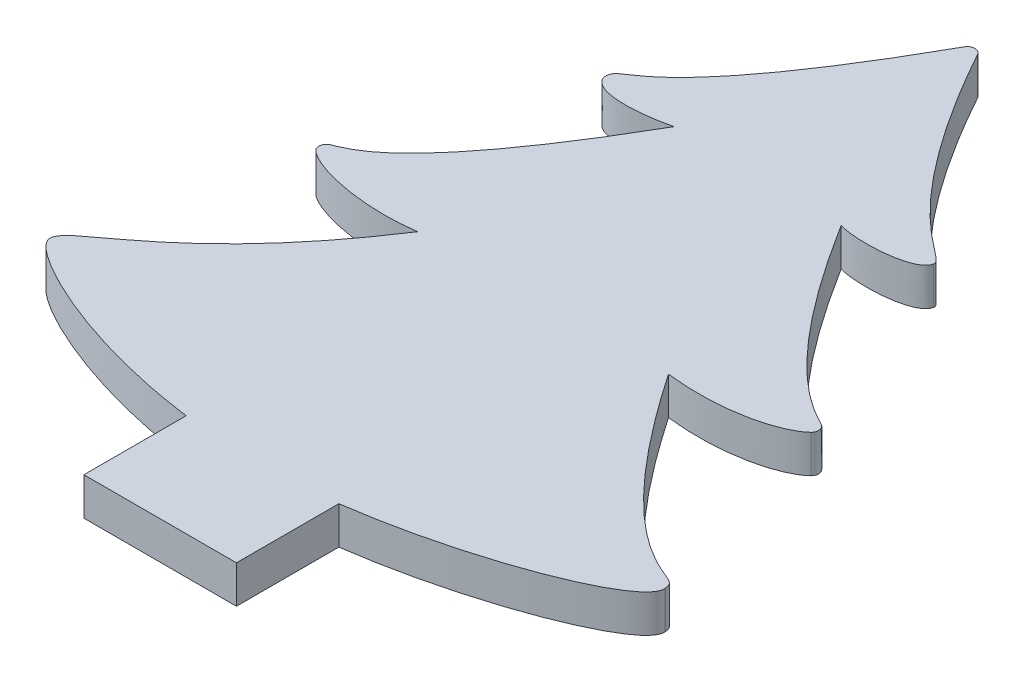
ISO-10303-21;
HEADER;
FILE_DESCRIPTION(('STEP AP214'),'2;1');
FILE_NAME('part.step','',(''),(''),'','','');
FILE_SCHEMA(('AUTOMOTIVE_DESIGN { 1 0 10303 214 1 1 1 1 }'));
ENDSEC;
DATA;
#1=APPLICATION_CONTEXT('core data for automotive mechanical design processes');
#2=APPLICATION_PROTOCOL_DEFINITION('international standard','automotive_design',2000,#1);
#3=PRODUCT_CONTEXT('',#1,'mechanical');
#4=PRODUCT('Part','Part','',(#3));
#5=PRODUCT_RELATED_PRODUCT_CATEGORY('part','',(#4));
#6=PRODUCT_DEFINITION_FORMATION('','',#4);
#7=PRODUCT_DEFINITION_CONTEXT('part definition',#1,'design');
#8=PRODUCT_DEFINITION('design','',#6,#7);
#9=PRODUCT_DEFINITION_SHAPE('','',#8);
#10=(LENGTH_UNIT() NAMED_UNIT(*) SI_UNIT(.MILLI.,.METRE.));
#11=(NAMED_UNIT(*) PLANE_ANGLE_UNIT() SI_UNIT($,.RADIAN.));
#12=(NAMED_UNIT(*) SI_UNIT($,.STERADIAN.) SOLID_ANGLE_UNIT());
#13=UNCERTAINTY_MEASURE_WITH_UNIT(LENGTH_MEASURE(1.E-05),#10,'distance_accuracy_value','');
#14=(GEOMETRIC_REPRESENTATION_CONTEXT(3) GLOBAL_UNCERTAINTY_ASSIGNED_CONTEXT((#13)) GLOBAL_UNIT_ASSIGNED_CONTEXT((#10,
#11,#12)) REPRESENTATION_CONTEXT('',''));
#15=CARTESIAN_POINT('',(0.,0.,0.));
#16=DIRECTION('',(0.,0.,1.));
#17=DIRECTION('',(1.,0.,0.));
#18=AXIS2_PLACEMENT_3D('',#15,#16,#17);
#19=CARTESIAN_POINT('',(-26.46094707479,5.,-51.1142111528936));
#20=CARTESIAN_POINT('',(-43.2890628601737,5.,-20.4825244166261));
#21=CARTESIAN_POINT('',(-47.9718443473797,5.,-25.3018231207679));
#22=CARTESIAN_POINT('',(-47.800827469106,5.,-22.1543100976667));
#23=B_SPLINE_CURVE_WITH_KNOTS('',3,(#19,#20,#21,#22),.UNSPECIFIED.,.F.,.F.,(4,4),(0.,1.),.UNSPECIFIED.);
#24=DIRECTION('',(0.,-1.,0.));
#25=VECTOR('',#24,1.);
#26=SURFACE_OF_LINEAR_EXTRUSION('',#23,#25);
#27=CARTESIAN_POINT('',(-27.3403097795806,5.,-49.5258288658324));
#28=VERTEX_POINT('',#27);
#29=CARTESIAN_POINT('',(-47.8051715184404,5.,-22.2851959053024));
#30=VERTEX_POINT('',#29);
#31=EDGE_CURVE('E282',#28,#30,#23,.T.);
#32=ORIENTED_EDGE('',*,*,#31,.F.);
#33=DIRECTION('',(0.,-1.,0.));
#34=VECTOR('',#33,1.);
#35=CARTESIAN_POINT('',(-27.3403097795806,5.,-49.5258288658324));
#36=LINE('',#35,#34);
#37=CARTESIAN_POINT('',(-27.3403097795806,0.,-49.5258288658324));
#38=VERTEX_POINT('',#37);
#39=EDGE_CURVE('E383',#28,#38,#36,.T.);
#40=ORIENTED_EDGE('',*,*,#39,.T.);
#41=CARTESIAN_POINT('',(-26.46094707479,0.,-51.1142111528936));
#42=CARTESIAN_POINT('',(-43.2890628601737,0.,-20.4825244166261));
#43=CARTESIAN_POINT('',(-47.9718443473797,0.,-25.3018231207679));
#44=CARTESIAN_POINT('',(-47.800827469106,0.,-22.1543100976667));
#45=B_SPLINE_CURVE_WITH_KNOTS('',3,(#41,#42,#43,#44),.UNSPECIFIED.,.F.,.F.,(4,4),(0.,1.),.UNSPECIFIED.);
#46=CARTESIAN_POINT('',(-47.8051715184404,0.,-22.2851959053024));
#47=VERTEX_POINT('',#46);
#48=EDGE_CURVE('E511',#38,#47,#45,.T.);
#49=ORIENTED_EDGE('',*,*,#48,.T.);
#50=DIRECTION('',(0.,-1.,0.));
#51=VECTOR('',#50,1.);
#52=CARTESIAN_POINT('',(-47.8051715184404,0.,-22.2851959053024));
#53=LINE('',#52,#51);
#54=EDGE_CURVE('E317',#47,#30,#53,.F.);
#55=ORIENTED_EDGE('',*,*,#54,.T.);
#56=EDGE_LOOP('',(#32,#40,#49,#55));
#57=FACE_BOUND('',#56,.T.);
#58=ADVANCED_FACE('F40',(#57),#26,.F.);
#59=CARTESIAN_POINT('',(-47.800827469106,5.,-22.1543100976667));
#60=CARTESIAN_POINT('',(-47.4104047515543,5.,-20.1884154408875));
#61=CARTESIAN_POINT('',(-42.9397855502199,5.,-19.7613952442805));
#62=CARTESIAN_POINT('',(-37.4406139998054,5.,-21.054048915975));
#63=B_SPLINE_CURVE_WITH_KNOTS('',3,(#59,#60,#61,#62),.UNSPECIFIED.,.F.,.F.,(4,4),(0.,1.),.UNSPECIFIED.);
#64=DIRECTION('',(0.,-1.,0.));
#65=VECTOR('',#64,1.);
#66=SURFACE_OF_LINEAR_EXTRUSION('',#63,#65);
#67=CARTESIAN_POINT('',(-47.7471264173741,5.,-21.9595594724381));
#68=VERTEX_POINT('',#67);
#69=CARTESIAN_POINT('',(-37.4406139998054,5.,-21.054048915975));
#70=VERTEX_POINT('',#69);
#71=EDGE_CURVE('E422',#68,#70,#63,.T.);
#72=ORIENTED_EDGE('',*,*,#71,.F.);
#73=DIRECTION('',(0.,-1.,0.));
#74=VECTOR('',#73,1.);
#75=CARTESIAN_POINT('',(-47.7471264173741,5.,-21.959559472438));
#76=LINE('',#75,#74);
#77=CARTESIAN_POINT('',(-47.7471264173741,0.,-21.9595594724381));
#78=VERTEX_POINT('',#77);
#79=EDGE_CURVE('E303',#68,#78,#76,.T.);
#80=ORIENTED_EDGE('',*,*,#79,.T.);
#81=CARTESIAN_POINT('',(-47.800827469106,0.,-22.1543100976667));
#82=CARTESIAN_POINT('',(-47.4104047515543,0.,-20.1884154408875));
#83=CARTESIAN_POINT('',(-42.9397855502199,0.,-19.7613952442805));
#84=CARTESIAN_POINT('',(-37.4406139998054,0.,-21.054048915975));
#85=B_SPLINE_CURVE_WITH_KNOTS('',3,(#81,#82,#83,#84),.UNSPECIFIED.,.F.,.F.,(4,4),(0.,1.),.UNSPECIFIED.);
#86=CARTESIAN_POINT('',(-37.4406139998054,0.,-21.054048915975));
#87=VERTEX_POINT('',#86);
#88=EDGE_CURVE('E516',#78,#87,#85,.T.);
#89=ORIENTED_EDGE('',*,*,#88,.T.);
#90=DIRECTION('',(0.,-1.,0.));
#91=VECTOR('',#90,1.);
#92=CARTESIAN_POINT('',(-37.4406139998054,5.,-21.054048915975));
#93=LINE('',#92,#91);
#94=EDGE_CURVE('E299',#70,#87,#93,.T.);
#95=ORIENTED_EDGE('',*,*,#94,.F.);
#96=EDGE_LOOP('',(#72,#80,#89,#95));
#97=FACE_BOUND('',#96,.T.);
#98=ADVANCED_FACE('F443',(#97),#66,.F.);
#99=CARTESIAN_POINT('',(-37.4406139998054,5.,-21.054048915975));
#100=CARTESIAN_POINT('',(-53.7464806232736,5.,7.34837010130482));
#101=CARTESIAN_POINT('',(-58.6463566748657,5.,2.30572016613151));
#102=CARTESIAN_POINT('',(-58.8963401885391,5.,4.69945124017866));
#103=B_SPLINE_CURVE_WITH_KNOTS('',3,(#99,#100,#101,#102),.UNSPECIFIED.,.F.,.F.,(4,4),(0.,1.),.UNSPECIFIED.);
#104=DIRECTION('',(0.,-1.,0.));
#105=VECTOR('',#104,1.);
#106=SURFACE_OF_LINEAR_EXTRUSION('',#103,#105);
#107=CARTESIAN_POINT('',(-37.4406139998054,0.,-21.054048915975));
#108=CARTESIAN_POINT('',(-53.7464806232736,0.,7.34837010130482));
#109=CARTESIAN_POINT('',(-58.6463566748657,0.,2.30572016613151));
#110=CARTESIAN_POINT('',(-58.8963401885391,0.,4.69945124017866));
#111=B_SPLINE_CURVE_WITH_KNOTS('',3,(#107,#108,#109,#110),.UNSPECIFIED.,.F.,.F.,(4,4),(0.,1.),.UNSPECIFIED.);
#112=CARTESIAN_POINT('',(-58.21100737465,0.,3.86325577012163));
#113=VERTEX_POINT('',#112);
#114=EDGE_CURVE('E570',#87,#113,#111,.T.);
#115=ORIENTED_EDGE('',*,*,#114,.T.);
#116=DIRECTION('',(0.,-1.,0.));
#117=VECTOR('',#116,1.);
#118=CARTESIAN_POINT('',(-58.21100737465,0.,3.86325577012163));
#119=LINE('',#118,#117);
#120=CARTESIAN_POINT('',(-58.21100737465,5.,3.86325577012163));
#121=VERTEX_POINT('',#120);
#122=EDGE_CURVE('E339',#113,#121,#119,.F.);
#123=ORIENTED_EDGE('',*,*,#122,.T.);
#124=EDGE_CURVE('E418',#70,#121,#103,.T.);
#125=ORIENTED_EDGE('',*,*,#124,.F.);
#126=ORIENTED_EDGE('',*,*,#94,.T.);
#127=EDGE_LOOP('',(#115,#123,#125,#126));
#128=FACE_BOUND('',#127,.T.);
#129=ADVANCED_FACE('F604',(#128),#106,.F.);
#130=CARTESIAN_POINT('',(-58.8963401885391,5.,4.69945124017865));
#131=CARTESIAN_POINT('',(-59.0306459865497,5.,6.4806781155983));
#132=CARTESIAN_POINT('',(-50.7799627606112,5.,9.25178864561152));
#133=CARTESIAN_POINT('',(-42.3819496602005,5.,8.05091230420457));
#134=B_SPLINE_CURVE_WITH_KNOTS('',3,(#130,#131,#132,#133),.UNSPECIFIED.,.F.,.F.,(4,4),(0.,1.),.UNSPECIFIED.);
#135=DIRECTION('',(0.,-1.,0.));
#136=VECTOR('',#135,1.);
#137=SURFACE_OF_LINEAR_EXTRUSION('',#134,#136);
#138=CARTESIAN_POINT('',(-58.4802850236266,5.,5.49409460981877));
#139=VERTEX_POINT('',#138);
#140=CARTESIAN_POINT('',(-42.3819496602005,5.,8.05091230420457));
#141=VERTEX_POINT('',#140);
#142=EDGE_CURVE('E415',#139,#141,#134,.T.);
#143=ORIENTED_EDGE('',*,*,#142,.F.);
#144=DIRECTION('',(0.,-1.,0.));
#145=VECTOR('',#144,1.);
#146=CARTESIAN_POINT('',(-58.4802850236266,5.,5.49409460981876));
#147=LINE('',#146,#145);
#148=CARTESIAN_POINT('',(-58.4802850236266,0.,5.49409460981877));
#149=VERTEX_POINT('',#148);
#150=EDGE_CURVE('E335',#139,#149,#147,.T.);
#151=ORIENTED_EDGE('',*,*,#150,.T.);
#152=CARTESIAN_POINT('',(-58.8963401885391,0.,4.69945124017865));
#153=CARTESIAN_POINT('',(-59.0306459865497,0.,6.4806781155983));
#154=CARTESIAN_POINT('',(-50.7799627606112,0.,9.25178864561152));
#155=CARTESIAN_POINT('',(-42.3819496602005,0.,8.05091230420457));
#156=B_SPLINE_CURVE_WITH_KNOTS('',3,(#152,#153,#154,#155),.UNSPECIFIED.,.F.,.F.,(4,4),(0.,1.),.UNSPECIFIED.);
#157=CARTESIAN_POINT('',(-42.3819496602005,0.,8.05091230420457));
#158=VERTEX_POINT('',#157);
#159=EDGE_CURVE('E228',#149,#158,#156,.T.);
#160=ORIENTED_EDGE('',*,*,#159,.T.);
#161=DIRECTION('',(0.,-1.,0.));
#162=VECTOR('',#161,1.);
#163=CARTESIAN_POINT('',(-42.3819496602005,5.,8.05091230420457));
#164=LINE('',#163,#162);
#165=EDGE_CURVE('E295',#141,#158,#164,.T.);
#166=ORIENTED_EDGE('',*,*,#165,.F.);
#167=EDGE_LOOP('',(#143,#151,#160,#166));
#168=FACE_BOUND('',#167,.T.);
#169=ADVANCED_FACE('F591',(#168),#137,.F.);
#170=CARTESIAN_POINT('',(-42.3819496602005,5.,8.05091230420457));
#171=CARTESIAN_POINT('',(-55.2657430992836,5.,27.8352838186386));
#172=CARTESIAN_POINT('',(-66.3455714112481,5.,30.4835954617912));
#173=CARTESIAN_POINT('',(-66.0463014559429,5.,33.3060006103379));
#174=B_SPLINE_CURVE_WITH_KNOTS('',3,(#170,#171,#172,#173),.UNSPECIFIED.,.F.,.F.,(4,4),(0.,1.),.UNSPECIFIED.);
#175=DIRECTION('',(0.,-1.,0.));
#176=VECTOR('',#175,1.);
#177=SURFACE_OF_LINEAR_EXTRUSION('',#174,#176);
#178=CARTESIAN_POINT('',(-42.3819496602005,0.,8.05091230420457));
#179=CARTESIAN_POINT('',(-55.2657430992836,0.,27.8352838186386));
#180=CARTESIAN_POINT('',(-66.3455714112481,0.,30.4835954617912));
#181=CARTESIAN_POINT('',(-66.0463014559429,0.,33.3060006103379));
#182=B_SPLINE_CURVE_WITH_KNOTS('',3,(#178,#179,#180,#181),.UNSPECIFIED.,.F.,.F.,(4,4),(0.,1.),.UNSPECIFIED.);
#183=CARTESIAN_POINT('',(-66.0481648431497,0.,33.2867693837771));
#184=VERTEX_POINT('',#183);
#185=EDGE_CURVE('E221',#158,#184,#182,.T.);
#186=ORIENTED_EDGE('',*,*,#185,.T.);
#187=DIRECTION('',(0.,-1.,0.));
#188=VECTOR('',#187,1.);
#189=CARTESIAN_POINT('',(-66.0481648431497,0.,33.2867693837771));
#190=LINE('',#189,#188);
#191=CARTESIAN_POINT('',(-66.0481648431497,5.,33.2867693837771));
#192=VERTEX_POINT('',#191);
#193=EDGE_CURVE('E332',#184,#192,#190,.F.);
#194=ORIENTED_EDGE('',*,*,#193,.T.);
#195=EDGE_CURVE('E411',#141,#192,#174,.T.);
#196=ORIENTED_EDGE('',*,*,#195,.F.);
#197=ORIENTED_EDGE('',*,*,#165,.T.);
#198=EDGE_LOOP('',(#186,#194,#196,#197));
#199=FACE_BOUND('',#198,.T.);
#200=ADVANCED_FACE('F596',(#199),#177,.F.);
#201=CARTESIAN_POINT('',(-66.0463014559429,5.,33.3060006103379));
#202=CARTESIAN_POINT('',(-65.9776236253739,5.,36.050325122992));
#203=CARTESIAN_POINT('',(-47.6816741974499,5.,45.2884353869615));
#204=CARTESIAN_POINT('',(-26.4609470747899,5.,45.2615921349245));
#205=B_SPLINE_CURVE_WITH_KNOTS('',3,(#201,#202,#203,#204),.UNSPECIFIED.,.F.,.F.,(4,4),(0.,1.),.UNSPECIFIED.);
#206=DIRECTION('',(0.,-1.,0.));
#207=VECTOR('',#206,1.);
#208=SURFACE_OF_LINEAR_EXTRUSION('',#205,#207);
#209=CARTESIAN_POINT('',(-66.0463014559429,0.,33.3060006103379));
#210=CARTESIAN_POINT('',(-65.9776236253739,0.,36.050325122992));
#211=CARTESIAN_POINT('',(-47.6816741974499,0.,45.2884353869615));
#212=CARTESIAN_POINT('',(-26.4609470747899,0.,45.2615921349245));
#213=B_SPLINE_CURVE_WITH_KNOTS('',3,(#209,#210,#211,#212),.UNSPECIFIED.,.F.,.F.,(4,4),(0.,1.),.UNSPECIFIED.);
#214=CARTESIAN_POINT('',(-66.0456582109323,0.,33.3227895523358));
#215=VERTEX_POINT('',#214);
#216=CARTESIAN_POINT('',(-36.5955437582762,0.,44.5970663604738));
#217=VERTEX_POINT('',#216);
#218=EDGE_CURVE('E208',#215,#217,#213,.T.);
#219=ORIENTED_EDGE('',*,*,#218,.T.);
#220=DIRECTION('',(0.,1.,0.));
#221=VECTOR('',#220,1.);
#222=CARTESIAN_POINT('',(-36.5955437582762,0.,44.5970663604738));
#223=LINE('',#222,#221);
#224=CARTESIAN_POINT('',(-36.5955437582762,5.,44.5970663604738));
#225=VERTEX_POINT('',#224);
#226=EDGE_CURVE('E190',#217,#225,#223,.T.);
#227=ORIENTED_EDGE('',*,*,#226,.T.);
#228=CARTESIAN_POINT('',(-66.0456582109323,5.,33.3227895523358));
#229=VERTEX_POINT('',#228);
#230=EDGE_CURVE('E408',#229,#225,#205,.T.);
#231=ORIENTED_EDGE('',*,*,#230,.F.);
#232=DIRECTION('',(0.,-1.,0.));
#233=VECTOR('',#232,1.);
#234=CARTESIAN_POINT('',(-66.0456582109324,5.,33.3227895523358));
#235=LINE('',#234,#233);
#236=EDGE_CURVE('E218',#229,#215,#235,.T.);
#237=ORIENTED_EDGE('',*,*,#236,.T.);
#238=EDGE_LOOP('',(#219,#227,#231,#237));
#239=FACE_BOUND('',#238,.T.);
#240=ADVANCED_FACE('F216',(#239),#208,.F.);
#241=CARTESIAN_POINT('',(-26.46094707479,5.,45.2615921349245));
#242=CARTESIAN_POINT('',(-9.67683552126472,5.,45.5867609119514));
#243=CARTESIAN_POINT('',(15.6871116916868,5.,36.8617452655546));
#244=CARTESIAN_POINT('',(15.0600009477621,5.,32.6373889791137));
#245=B_SPLINE_CURVE_WITH_KNOTS('',3,(#241,#242,#243,#244),.UNSPECIFIED.,.F.,.F.,(4,4),(0.,1.),.UNSPECIFIED.);
#246=DIRECTION('',(0.,-1.,0.));
#247=VECTOR('',#246,1.);
#248=SURFACE_OF_LINEAR_EXTRUSION('',#245,#247);
#249=CARTESIAN_POINT('',(-16.334320806362,5.,44.5781330491212));
#250=VERTEX_POINT('',#249);
#251=CARTESIAN_POINT('',(15.0648258625216,5.,32.6744679738626));
#252=VERTEX_POINT('',#251);
#253=EDGE_CURVE('E405',#250,#252,#245,.T.);
#254=ORIENTED_EDGE('',*,*,#253,.F.);
#255=DIRECTION('',(0.,1.,0.));
#256=VECTOR('',#255,1.);
#257=CARTESIAN_POINT('',(-16.334320806362,0.,44.5781330491212));
#258=LINE('',#257,#256);
#259=CARTESIAN_POINT('',(-16.334320806362,0.,44.5781330491212));
#260=VERTEX_POINT('',#259);
#261=EDGE_CURVE('E507',#260,#250,#258,.T.);
#262=ORIENTED_EDGE('',*,*,#261,.F.);
#263=CARTESIAN_POINT('',(-26.46094707479,0.,45.2615921349245));
#264=CARTESIAN_POINT('',(-9.67683552126472,0.,45.5867609119514));
#265=CARTESIAN_POINT('',(15.6871116916868,0.,36.8617452655546));
#266=CARTESIAN_POINT('',(15.0600009477621,0.,32.6373889791137));
#267=B_SPLINE_CURVE_WITH_KNOTS('',3,(#263,#264,#265,#266),.UNSPECIFIED.,.F.,.F.,(4,4),(0.,1.),.UNSPECIFIED.);
#268=CARTESIAN_POINT('',(15.0648258625216,0.,32.6744679738626));
#269=VERTEX_POINT('',#268);
#270=EDGE_CURVE('E220',#260,#269,#267,.T.);
#271=ORIENTED_EDGE('',*,*,#270,.T.);
#272=DIRECTION('',(0.,-1.,0.));
#273=VECTOR('',#272,1.);
#274=CARTESIAN_POINT('',(15.0648258625216,0.,32.6744679738626));
#275=LINE('',#274,#273);
#276=EDGE_CURVE('E353',#269,#252,#275,.F.);
#277=ORIENTED_EDGE('',*,*,#276,.T.);
#278=EDGE_LOOP('',(#254,#262,#271,#277));
#279=FACE_BOUND('',#278,.T.);
#280=ADVANCED_FACE('F505',(#279),#248,.F.);
#281=CARTESIAN_POINT('',(15.0600009477621,5.,32.6373889791137));
#282=CARTESIAN_POINT('',(15.0225458596558,5.,29.4750851951426));
#283=CARTESIAN_POINT('',(8.96279055385009,5.,34.7017587488998));
#284=CARTESIAN_POINT('',(-9.33864147602932,5.,7.79119338360951));
#285=B_SPLINE_CURVE_WITH_KNOTS('',3,(#281,#282,#283,#284),.UNSPECIFIED.,.F.,.F.,(4,4),(0.,1.),.UNSPECIFIED.);
#286=DIRECTION('',(0.,-1.,0.));
#287=VECTOR('',#286,1.);
#288=SURFACE_OF_LINEAR_EXTRUSION('',#285,#287);
#289=CARTESIAN_POINT('',(15.0590815907543,5.,32.5936312008287));
#290=VERTEX_POINT('',#289);
#291=CARTESIAN_POINT('',(-9.33864147602941,5.,7.7911933836095));
#292=VERTEX_POINT('',#291);
#293=EDGE_CURVE('E402',#290,#292,#285,.T.);
#294=ORIENTED_EDGE('',*,*,#293,.F.);
#295=DIRECTION('',(0.,-1.,0.));
#296=VECTOR('',#295,1.);
#297=CARTESIAN_POINT('',(15.0590815907542,5.,32.5936312008254));
#298=LINE('',#297,#296);
#299=CARTESIAN_POINT('',(15.0590815907543,0.,32.5936312008287));
#300=VERTEX_POINT('',#299);
#301=EDGE_CURVE('E349',#290,#300,#298,.T.);
#302=ORIENTED_EDGE('',*,*,#301,.T.);
#303=CARTESIAN_POINT('',(15.0600009477621,0.,32.6373889791137));
#304=CARTESIAN_POINT('',(15.0225458596558,0.,29.4750851951426));
#305=CARTESIAN_POINT('',(8.96279055385009,0.,34.7017587488998));
#306=CARTESIAN_POINT('',(-9.33864147602932,0.,7.79119338360951));
#307=B_SPLINE_CURVE_WITH_KNOTS('',3,(#303,#304,#305,#306),.UNSPECIFIED.,.F.,.F.,(4,4),(0.,1.),.UNSPECIFIED.);
#308=CARTESIAN_POINT('',(-9.33864147602941,0.,7.7911933836095));
#309=VERTEX_POINT('',#308);
#310=EDGE_CURVE('E225',#300,#309,#307,.T.);
#311=ORIENTED_EDGE('',*,*,#310,.T.);
#312=DIRECTION('',(0.,-1.,0.));
#313=VECTOR('',#312,1.);
#314=CARTESIAN_POINT('',(-9.33864147602941,5.,7.7911933836095));
#315=LINE('',#314,#313);
#316=EDGE_CURVE('E290',#292,#309,#315,.T.);
#317=ORIENTED_EDGE('',*,*,#316,.F.);
#318=EDGE_LOOP('',(#294,#302,#311,#317));
#319=FACE_BOUND('',#318,.T.);
#320=ADVANCED_FACE('F499',(#319),#288,.F.);
#321=CARTESIAN_POINT('',(-9.33864147602941,5.,7.7911933836095));
#322=CARTESIAN_POINT('',(-0.79960966506997,5.,8.76818365390028));
#323=CARTESIAN_POINT('',(5.63836749180853,5.,6.68150425234732));
#324=CARTESIAN_POINT('',(7.17289225562503,5.,4.60126431144356));
#325=B_SPLINE_CURVE_WITH_KNOTS('',3,(#321,#322,#323,#324),.UNSPECIFIED.,.F.,.F.,(4,4),(0.,1.),.UNSPECIFIED.);
#326=DIRECTION('',(0.,-1.,0.));
#327=VECTOR('',#326,1.);
#328=SURFACE_OF_LINEAR_EXTRUSION('',#325,#327);
#329=CARTESIAN_POINT('',(-9.33864147602941,0.,7.7911933836095));
#330=CARTESIAN_POINT('',(-0.79960966506997,0.,8.76818365390028));
#331=CARTESIAN_POINT('',(5.63836749180853,0.,6.68150425234732));
#332=CARTESIAN_POINT('',(7.17289225562503,0.,4.60126431144356));
#333=B_SPLINE_CURVE_WITH_KNOTS('',3,(#329,#330,#331,#332),.UNSPECIFIED.,.F.,.F.,(4,4),(0.,1.),.UNSPECIFIED.);
#334=CARTESIAN_POINT('',(6.79872593204115,0.,5.01906328379935));
#335=VERTEX_POINT('',#334);
#336=EDGE_CURVE('E248',#309,#335,#333,.T.);
#337=ORIENTED_EDGE('',*,*,#336,.T.);
#338=DIRECTION('',(0.,-1.,0.));
#339=VECTOR('',#338,1.);
#340=CARTESIAN_POINT('',(6.79872593204115,0.,5.01906328379935));
#341=LINE('',#340,#339);
#342=CARTESIAN_POINT('',(6.79872593204115,5.,5.01906328379935));
#343=VERTEX_POINT('',#342);
#344=EDGE_CURVE('E361',#335,#343,#341,.F.);
#345=ORIENTED_EDGE('',*,*,#344,.T.);
#346=EDGE_CURVE('E398',#292,#343,#325,.T.);
#347=ORIENTED_EDGE('',*,*,#346,.F.);
#348=ORIENTED_EDGE('',*,*,#316,.T.);
#349=EDGE_LOOP('',(#337,#345,#347,#348));
#350=FACE_BOUND('',#349,.T.);
#351=ADVANCED_FACE('F495',(#350),#328,.F.);
#352=CARTESIAN_POINT('',(7.17289225562503,5.,4.60126431144356));
#353=CARTESIAN_POINT('',(8.22123179046032,5.,2.12767223664505));
#354=CARTESIAN_POINT('',(1.78727035083967,5.,6.10389935117822));
#355=CARTESIAN_POINT('',(-14.9929544013102,5.,-20.804801043491));
#356=B_SPLINE_CURVE_WITH_KNOTS('',3,(#352,#353,#354,#355),.UNSPECIFIED.,.F.,.F.,(4,4),(0.,1.),.UNSPECIFIED.);
#357=DIRECTION('',(0.,-1.,0.));
#358=VECTOR('',#357,1.);
#359=SURFACE_OF_LINEAR_EXTRUSION('',#356,#358);
#360=CARTESIAN_POINT('',(6.6030411539207,5.,3.42314236564019));
#361=VERTEX_POINT('',#360);
#362=CARTESIAN_POINT('',(-14.9929544013102,5.,-20.804801043491));
#363=VERTEX_POINT('',#362);
#364=EDGE_CURVE('E395',#361,#363,#356,.T.);
#365=ORIENTED_EDGE('',*,*,#364,.F.);
#366=DIRECTION('',(0.,-1.,0.));
#367=VECTOR('',#366,1.);
#368=CARTESIAN_POINT('',(6.6030411539207,5.,3.42314236564019));
#369=LINE('',#368,#367);
#370=CARTESIAN_POINT('',(6.6030411539207,0.,3.42314236564019));
#371=VERTEX_POINT('',#370);
#372=EDGE_CURVE('E357',#361,#371,#369,.T.);
#373=ORIENTED_EDGE('',*,*,#372,.T.);
#374=CARTESIAN_POINT('',(7.17289225562503,0.,4.60126431144356));
#375=CARTESIAN_POINT('',(8.22123179046032,0.,2.12767223664505));
#376=CARTESIAN_POINT('',(1.78727035083967,0.,6.10389935117822));
#377=CARTESIAN_POINT('',(-14.9929544013102,0.,-20.804801043491));
#378=B_SPLINE_CURVE_WITH_KNOTS('',3,(#374,#375,#376,#377),.UNSPECIFIED.,.F.,.F.,(4,4),(0.,1.),.UNSPECIFIED.);
#379=CARTESIAN_POINT('',(-14.9929544013102,0.,-20.804801043491));
#380=VERTEX_POINT('',#379);
#381=EDGE_CURVE('E257',#371,#380,#378,.T.);
#382=ORIENTED_EDGE('',*,*,#381,.T.);
#383=DIRECTION('',(0.,-1.,0.));
#384=VECTOR('',#383,1.);
#385=CARTESIAN_POINT('',(-14.9929544013102,5.,-20.804801043491));
#386=LINE('',#385,#384);
#387=EDGE_CURVE('E283',#363,#380,#386,.T.);
#388=ORIENTED_EDGE('',*,*,#387,.F.);
#389=EDGE_LOOP('',(#365,#373,#382,#388));
#390=FACE_BOUND('',#389,.T.);
#391=ADVANCED_FACE('F482',(#390),#359,.F.);
#392=CARTESIAN_POINT('',(-14.9929544013102,5.,-20.804801043491));
#393=CARTESIAN_POINT('',(-12.5979759289823,5.,-19.9764626244904));
#394=CARTESIAN_POINT('',(-4.88721354292545,5.,-20.1870294909611));
#395=CARTESIAN_POINT('',(-4.41793615951232,5.,-22.4835567966431));
#396=B_SPLINE_CURVE_WITH_KNOTS('',3,(#392,#393,#394,#395),.UNSPECIFIED.,.F.,.F.,(4,4),(0.,1.),.UNSPECIFIED.);
#397=DIRECTION('',(0.,-1.,0.));
#398=VECTOR('',#397,1.);
#399=SURFACE_OF_LINEAR_EXTRUSION('',#396,#398);
#400=CARTESIAN_POINT('',(-14.9929544013102,0.,-20.804801043491));
#401=CARTESIAN_POINT('',(-12.5979759289823,0.,-19.9764626244904));
#402=CARTESIAN_POINT('',(-4.88721354292545,0.,-20.1870294909611));
#403=CARTESIAN_POINT('',(-4.41793615951232,0.,-22.4835567966431));
#404=B_SPLINE_CURVE_WITH_KNOTS('',3,(#400,#401,#402,#403),.UNSPECIFIED.,.F.,.F.,(4,4),(0.,1.),.UNSPECIFIED.);
#405=CARTESIAN_POINT('',(-4.41956217038432,0.,-22.475744455693));
#406=VERTEX_POINT('',#405);
#407=EDGE_CURVE('E265',#380,#406,#404,.T.);
#408=ORIENTED_EDGE('',*,*,#407,.T.);
#409=DIRECTION('',(0.,-1.,0.));
#410=VECTOR('',#409,1.);
#411=CARTESIAN_POINT('',(-4.41956217038523,0.,-22.4757444556887));
#412=LINE('',#411,#410);
#413=CARTESIAN_POINT('',(-4.41956217038432,5.,-22.475744455693));
#414=VERTEX_POINT('',#413);
#415=EDGE_CURVE('E346',#406,#414,#412,.F.);
#416=ORIENTED_EDGE('',*,*,#415,.T.);
#417=EDGE_CURVE('E391',#363,#414,#396,.T.);
#418=ORIENTED_EDGE('',*,*,#417,.F.);
#419=ORIENTED_EDGE('',*,*,#387,.T.);
#420=EDGE_LOOP('',(#408,#416,#418,#419));
#421=FACE_BOUND('',#420,.T.);
#422=ADVANCED_FACE('F487',(#421),#399,.F.);
#423=CARTESIAN_POINT('',(-4.41793615951232,5.,-22.4835567966431));
#424=CARTESIAN_POINT('',(-4.02842379671469,5.,-24.1031837642893));
#425=CARTESIAN_POINT('',(-12.4275480137237,5.,-25.1084932928631));
#426=CARTESIAN_POINT('',(-26.46094707479,5.,-51.1142111528936));
#427=B_SPLINE_CURVE_WITH_KNOTS('',3,(#423,#424,#425,#426),.UNSPECIFIED.,.F.,.F.,(4,4),(0.,1.),.UNSPECIFIED.);
#428=DIRECTION('',(0.,-1.,0.));
#429=VECTOR('',#428,1.);
#430=SURFACE_OF_LINEAR_EXTRUSION('',#427,#429);
#431=CARTESIAN_POINT('',(-4.41793615951232,0.,-22.4835567966431));
#432=CARTESIAN_POINT('',(-4.02842379671469,0.,-24.1031837642893));
#433=CARTESIAN_POINT('',(-12.4275480137237,0.,-25.1084932928631));
#434=CARTESIAN_POINT('',(-26.46094707479,0.,-51.1142111528936));
#435=B_SPLINE_CURVE_WITH_KNOTS('',3,(#431,#432,#433,#434),.UNSPECIFIED.,.F.,.F.,(4,4),(0.,1.),.UNSPECIFIED.);
#436=CARTESIAN_POINT('',(-4.41649495583451,0.,-22.4897232482734));
#437=VERTEX_POINT('',#436);
#438=CARTESIAN_POINT('',(-25.5917423281704,0.,-49.5221122293593));
#439=VERTEX_POINT('',#438);
#440=EDGE_CURVE('E274',#437,#439,#435,.T.);
#441=ORIENTED_EDGE('',*,*,#440,.T.);
#442=DIRECTION('',(0.,-1.,0.));
#443=VECTOR('',#442,1.);
#444=CARTESIAN_POINT('',(-25.5917423281704,0.,-49.5221122293593));
#445=LINE('',#444,#443);
#446=CARTESIAN_POINT('',(-25.5917423281704,5.,-49.5221122293593));
#447=VERTEX_POINT('',#446);
#448=EDGE_CURVE('E49',#439,#447,#445,.F.);
#449=ORIENTED_EDGE('',*,*,#448,.T.);
#450=CARTESIAN_POINT('',(-4.41649495583451,5.,-22.4897232482734));
#451=VERTEX_POINT('',#450);
#452=EDGE_CURVE('E291',#451,#447,#427,.T.);
#453=ORIENTED_EDGE('',*,*,#452,.F.);
#454=DIRECTION('',(0.,-1.,0.));
#455=VECTOR('',#454,1.);
#456=CARTESIAN_POINT('',(-4.41649495583451,5.,-22.4897232482734));
#457=LINE('',#456,#455);
#458=EDGE_CURVE('E342',#451,#437,#457,.T.);
#459=ORIENTED_EDGE('',*,*,#458,.T.);
#460=EDGE_LOOP('',(#441,#449,#453,#459));
#461=FACE_BOUND('',#460,.T.);
#462=ADVANCED_FACE('F491',(#461),#430,.F.);
#463=CARTESIAN_POINT('',(-43.5055620208195,5.,-26.3276954828428));
#464=DIRECTION('',(0.,1.,0.));
#465=DIRECTION('',(0.,0.,1.));
#466=AXIS2_PLACEMENT_3D('',#463,#464,#465);
#467=PLANE('',#466);
#468=DIRECTION('',(0.,0.,-1.));
#469=VECTOR('',#468,1.);
#470=CARTESIAN_POINT('',(-16.334320806362,5.,58.1796079656863));
#471=LINE('',#470,#469);
#472=CARTESIAN_POINT('',(-16.334320806362,5.,58.1796079656863));
#473=VERTEX_POINT('',#472);
#474=EDGE_CURVE('E213',#473,#250,#471,.T.);
#475=ORIENTED_EDGE('',*,*,#474,.T.);
#476=ORIENTED_EDGE('',*,*,#253,.T.);
#477=CARTESIAN_POINT('',(16.058619258015,5.,32.5632264030641));
#478=DIRECTION('',(0.,1.,0.));
#479=DIRECTION('',(0.,0.,1.));
#480=AXIS2_PLACEMENT_3D('',#477,#478,#479);
#481=CIRCLE('',#480,1.);
#482=EDGE_CURVE('E380',#252,#290,#481,.F.);
#483=ORIENTED_EDGE('',*,*,#482,.T.);
#484=ORIENTED_EDGE('',*,*,#293,.T.);
#485=ORIENTED_EDGE('',*,*,#346,.T.);
#486=CARTESIAN_POINT('',(6.11058936676096,5.,4.29348209087579));
#487=DIRECTION('',(0.,1.,0.));
#488=DIRECTION('',(0.,0.,1.));
#489=AXIS2_PLACEMENT_3D('',#486,#487,#488);
#490=CIRCLE('',#489,1.);
#491=EDGE_CURVE('E321',#343,#361,#490,.T.);
#492=ORIENTED_EDGE('',*,*,#491,.T.);
#493=ORIENTED_EDGE('',*,*,#364,.T.);
#494=ORIENTED_EDGE('',*,*,#417,.T.);
#495=CARTESIAN_POINT('',(-3.44129019472411,5.,-22.2684187659248));
#496=DIRECTION('',(0.,1.,0.));
#497=DIRECTION('',(0.,0.,1.));
#498=AXIS2_PLACEMENT_3D('',#495,#496,#497);
#499=CIRCLE('',#498,1.);
#500=EDGE_CURVE('E373',#414,#451,#499,.F.);
#501=ORIENTED_EDGE('',*,*,#500,.T.);
#502=ORIENTED_EDGE('',*,*,#452,.T.);
#503=CARTESIAN_POINT('',(-26.467057809747,5.,-49.0385599491326));
#504=DIRECTION('',(0.,1.,0.));
#505=DIRECTION('',(0.,0.,1.));
#506=AXIS2_PLACEMENT_3D('',#503,#504,#505);
#507=CIRCLE('',#506,1.);
#508=EDGE_CURVE('E11',#447,#28,#507,.T.);
#509=ORIENTED_EDGE('',*,*,#508,.T.);
#510=ORIENTED_EDGE('',*,*,#31,.T.);
#511=CARTESIAN_POINT('',(-46.805224054787,5.,-22.2954462678807));
#512=DIRECTION('',(0.,1.,0.));
#513=DIRECTION('',(0.,0.,1.));
#514=AXIS2_PLACEMENT_3D('',#511,#512,#513);
#515=CIRCLE('',#514,1.);
#516=EDGE_CURVE('E327',#30,#68,#515,.T.);
#517=ORIENTED_EDGE('',*,*,#516,.T.);
#518=ORIENTED_EDGE('',*,*,#71,.T.);
#519=ORIENTED_EDGE('',*,*,#124,.T.);
#520=CARTESIAN_POINT('',(-57.7901721451152,5.,4.77039286537375));
#521=DIRECTION('',(0.,1.,0.));
#522=DIRECTION('',(0.,0.,1.));
#523=AXIS2_PLACEMENT_3D('',#520,#521,#522);
#524=CIRCLE('',#523,1.);
#525=EDGE_CURVE('E324',#121,#139,#524,.T.);
#526=ORIENTED_EDGE('',*,*,#525,.T.);
#527=ORIENTED_EDGE('',*,*,#142,.T.);
#528=ORIENTED_EDGE('',*,*,#195,.T.);
#529=CARTESIAN_POINT('',(-67.0443363369546,5.,33.3741899473227));
#530=DIRECTION('',(0.,1.,0.));
#531=DIRECTION('',(0.,0.,1.));
#532=AXIS2_PLACEMENT_3D('',#529,#530,#531);
#533=CIRCLE('',#532,1.);
#534=EDGE_CURVE('E367',#192,#229,#533,.F.);
#535=ORIENTED_EDGE('',*,*,#534,.T.);
#536=ORIENTED_EDGE('',*,*,#230,.T.);
#537=DIRECTION('',(0.,0.,1.));
#538=VECTOR('',#537,1.);
#539=CARTESIAN_POINT('',(-36.5955437582762,5.,44.5970663604738));
#540=LINE('',#539,#538);
#541=CARTESIAN_POINT('',(-36.5955437582762,5.,58.1796079656863));
#542=VERTEX_POINT('',#541);
#543=EDGE_CURVE('E195',#225,#542,#540,.T.);
#544=ORIENTED_EDGE('',*,*,#543,.T.);
#545=DIRECTION('',(1.,0.,0.));
#546=VECTOR('',#545,1.);
#547=CARTESIAN_POINT('',(-36.5955437582762,5.,58.1796079656863));
#548=LINE('',#547,#546);
#549=EDGE_CURVE('E525',#542,#473,#548,.T.);
#550=ORIENTED_EDGE('',*,*,#549,.T.);
#551=EDGE_LOOP('',(#475,#476,#483,#484,#485,#492,#493,#494,#501,#502,#509,#510,#517,#518,#519,
#526,#527,#528,#535,#536,#544,#550));
#552=FACE_BOUND('',#551,.T.);
#553=ADVANCED_FACE('F478',(#552),#467,.T.);
#554=CARTESIAN_POINT('',(-43.5055620208195,0.,-26.3276954828428));
#555=DIRECTION('',(0.,1.,0.));
#556=DIRECTION('',(0.,0.,1.));
#557=AXIS2_PLACEMENT_3D('',#554,#555,#556);
#558=PLANE('',#557);
#559=ORIENTED_EDGE('',*,*,#270,.F.);
#560=DIRECTION('',(0.,0.,-1.));
#561=VECTOR('',#560,1.);
#562=CARTESIAN_POINT('',(-16.334320806362,0.,58.1796079656863));
#563=LINE('',#562,#561);
#564=CARTESIAN_POINT('',(-16.334320806362,0.,58.1796079656863));
#565=VERTEX_POINT('',#564);
#566=EDGE_CURVE('E202',#565,#260,#563,.T.);
#567=ORIENTED_EDGE('',*,*,#566,.F.);
#568=DIRECTION('',(1.,0.,0.));
#569=VECTOR('',#568,1.);
#570=CARTESIAN_POINT('',(-36.5955437582762,0.,58.1796079656863));
#571=LINE('',#570,#569);
#572=CARTESIAN_POINT('',(-36.5955437582762,0.,58.1796079656863));
#573=VERTEX_POINT('',#572);
#574=EDGE_CURVE('E211',#573,#565,#571,.T.);
#575=ORIENTED_EDGE('',*,*,#574,.F.);
#576=DIRECTION('',(0.,0.,1.));
#577=VECTOR('',#576,1.);
#578=CARTESIAN_POINT('',(-36.5955437582762,0.,44.5970663604738));
#579=LINE('',#578,#577);
#580=EDGE_CURVE('E193',#217,#573,#579,.T.);
#581=ORIENTED_EDGE('',*,*,#580,.F.);
#582=ORIENTED_EDGE('',*,*,#218,.F.);
#583=CARTESIAN_POINT('',(-67.0443363369546,0.,33.3741899473227));
#584=DIRECTION('',(0.,1.,0.));
#585=DIRECTION('',(0.,0.,1.));
#586=AXIS2_PLACEMENT_3D('',#583,#584,#585);
#587=CIRCLE('',#586,1.);
#588=EDGE_CURVE('E364',#215,#184,#587,.T.);
#589=ORIENTED_EDGE('',*,*,#588,.T.);
#590=ORIENTED_EDGE('',*,*,#185,.F.);
#591=ORIENTED_EDGE('',*,*,#159,.F.);
#592=CARTESIAN_POINT('',(-57.7901721451152,0.,4.77039286537375));
#593=DIRECTION('',(0.,1.,0.));
#594=DIRECTION('',(0.,0.,1.));
#595=AXIS2_PLACEMENT_3D('',#592,#593,#594);
#596=CIRCLE('',#595,1.);
#597=EDGE_CURVE('E310',#149,#113,#596,.F.);
#598=ORIENTED_EDGE('',*,*,#597,.T.);
#599=ORIENTED_EDGE('',*,*,#114,.F.);
#600=ORIENTED_EDGE('',*,*,#88,.F.);
#601=CARTESIAN_POINT('',(-46.805224054787,0.,-22.2954462678807));
#602=DIRECTION('',(0.,1.,0.));
#603=DIRECTION('',(0.,0.,1.));
#604=AXIS2_PLACEMENT_3D('',#601,#602,#603);
#605=CIRCLE('',#604,1.);
#606=EDGE_CURVE('E313',#78,#47,#605,.F.);
#607=ORIENTED_EDGE('',*,*,#606,.T.);
#608=ORIENTED_EDGE('',*,*,#48,.F.);
#609=CARTESIAN_POINT('',(-26.467057809747,0.,-49.0385599491326));
#610=DIRECTION('',(0.,1.,0.));
#611=DIRECTION('',(0.,0.,1.));
#612=AXIS2_PLACEMENT_3D('',#609,#610,#611);
#613=CIRCLE('',#612,1.);
#614=EDGE_CURVE('E63',#38,#439,#613,.F.);
#615=ORIENTED_EDGE('',*,*,#614,.T.);
#616=ORIENTED_EDGE('',*,*,#440,.F.);
#617=CARTESIAN_POINT('',(-3.44129019472411,0.,-22.2684187659248));
#618=DIRECTION('',(0.,1.,0.));
#619=DIRECTION('',(0.,0.,1.));
#620=AXIS2_PLACEMENT_3D('',#617,#618,#619);
#621=CIRCLE('',#620,1.);
#622=EDGE_CURVE('E370',#437,#406,#621,.T.);
#623=ORIENTED_EDGE('',*,*,#622,.T.);
#624=ORIENTED_EDGE('',*,*,#407,.F.);
#625=ORIENTED_EDGE('',*,*,#381,.F.);
#626=CARTESIAN_POINT('',(6.11058936676096,0.,4.29348209087579));
#627=DIRECTION('',(0.,1.,0.));
#628=DIRECTION('',(0.,0.,1.));
#629=AXIS2_PLACEMENT_3D('',#626,#627,#628);
#630=CIRCLE('',#629,1.);
#631=EDGE_CURVE('E307',#371,#335,#630,.F.);
#632=ORIENTED_EDGE('',*,*,#631,.T.);
#633=ORIENTED_EDGE('',*,*,#336,.F.);
#634=ORIENTED_EDGE('',*,*,#310,.F.);
#635=CARTESIAN_POINT('',(16.058619258015,0.,32.5632264030641));
#636=DIRECTION('',(0.,1.,0.));
#637=DIRECTION('',(0.,0.,1.));
#638=AXIS2_PLACEMENT_3D('',#635,#636,#637);
#639=CIRCLE('',#638,1.);
#640=EDGE_CURVE('E376',#300,#269,#639,.T.);
#641=ORIENTED_EDGE('',*,*,#640,.T.);
#642=EDGE_LOOP('',(#559,#567,#575,#581,#582,#589,#590,#591,#598,#599,#600,#607,#608,#615,#616,
#623,#624,#625,#632,#633,#634,#641));
#643=FACE_BOUND('',#642,.T.);
#644=ADVANCED_FACE('F207',(#643),#558,.F.);
#645=CARTESIAN_POINT('',(-46.805224054787,2.5,-22.2954462678807));
#646=DIRECTION('',(0.,-1.,0.));
#647=DIRECTION('',(0.,0.,-1.));
#648=AXIS2_PLACEMENT_3D('',#645,#646,#647);
#649=CYLINDRICAL_SURFACE('',#648,1.);
#650=ORIENTED_EDGE('',*,*,#516,.F.);
#651=ORIENTED_EDGE('',*,*,#54,.F.);
#652=ORIENTED_EDGE('',*,*,#606,.F.);
#653=ORIENTED_EDGE('',*,*,#79,.F.);
#654=EDGE_LOOP('',(#650,#651,#652,#653));
#655=FACE_BOUND('',#654,.T.);
#656=ADVANCED_FACE('F446',(#655),#649,.T.);
#657=CARTESIAN_POINT('',(-67.0443363369546,2.5,33.3741899473227));
#658=DIRECTION('',(0.,-1.,0.));
#659=DIRECTION('',(0.,0.,-1.));
#660=AXIS2_PLACEMENT_3D('',#657,#658,#659);
#661=CYLINDRICAL_SURFACE('',#660,1.);
#662=ORIENTED_EDGE('',*,*,#534,.F.);
#663=ORIENTED_EDGE('',*,*,#193,.F.);
#664=ORIENTED_EDGE('',*,*,#588,.F.);
#665=ORIENTED_EDGE('',*,*,#236,.F.);
#666=EDGE_LOOP('',(#662,#663,#664,#665));
#667=FACE_BOUND('',#666,.T.);
#668=ADVANCED_FACE('F449',(#667),#661,.F.);
#669=CARTESIAN_POINT('',(-57.7901721451152,2.5,4.77039286537375));
#670=DIRECTION('',(0.,-1.,0.));
#671=DIRECTION('',(0.,0.,-1.));
#672=AXIS2_PLACEMENT_3D('',#669,#670,#671);
#673=CYLINDRICAL_SURFACE('',#672,1.);
#674=ORIENTED_EDGE('',*,*,#525,.F.);
#675=ORIENTED_EDGE('',*,*,#122,.F.);
#676=ORIENTED_EDGE('',*,*,#597,.F.);
#677=ORIENTED_EDGE('',*,*,#150,.F.);
#678=EDGE_LOOP('',(#674,#675,#676,#677));
#679=FACE_BOUND('',#678,.T.);
#680=ADVANCED_FACE('F453',(#679),#673,.T.);
#681=CARTESIAN_POINT('',(-3.44129019472411,2.5,-22.2684187659248));
#682=DIRECTION('',(0.,-1.,0.));
#683=DIRECTION('',(0.,0.,-1.));
#684=AXIS2_PLACEMENT_3D('',#681,#682,#683);
#685=CYLINDRICAL_SURFACE('',#684,1.);
#686=ORIENTED_EDGE('',*,*,#500,.F.);
#687=ORIENTED_EDGE('',*,*,#415,.F.);
#688=ORIENTED_EDGE('',*,*,#622,.F.);
#689=ORIENTED_EDGE('',*,*,#458,.F.);
#690=EDGE_LOOP('',(#686,#687,#688,#689));
#691=FACE_BOUND('',#690,.T.);
#692=ADVANCED_FACE('F457',(#691),#685,.F.);
#693=CARTESIAN_POINT('',(16.058619258015,2.5,32.5632264030641));
#694=DIRECTION('',(0.,-1.,0.));
#695=DIRECTION('',(0.,0.,-1.));
#696=AXIS2_PLACEMENT_3D('',#693,#694,#695);
#697=CYLINDRICAL_SURFACE('',#696,1.);
#698=ORIENTED_EDGE('',*,*,#482,.F.);
#699=ORIENTED_EDGE('',*,*,#276,.F.);
#700=ORIENTED_EDGE('',*,*,#640,.F.);
#701=ORIENTED_EDGE('',*,*,#301,.F.);
#702=EDGE_LOOP('',(#698,#699,#700,#701));
#703=FACE_BOUND('',#702,.T.);
#704=ADVANCED_FACE('F461',(#703),#697,.F.);
#705=CARTESIAN_POINT('',(6.11058936676096,2.5,4.29348209087579));
#706=DIRECTION('',(0.,-1.,0.));
#707=DIRECTION('',(0.,0.,-1.));
#708=AXIS2_PLACEMENT_3D('',#705,#706,#707);
#709=CYLINDRICAL_SURFACE('',#708,1.);
#710=ORIENTED_EDGE('',*,*,#491,.F.);
#711=ORIENTED_EDGE('',*,*,#344,.F.);
#712=ORIENTED_EDGE('',*,*,#631,.F.);
#713=ORIENTED_EDGE('',*,*,#372,.F.);
#714=EDGE_LOOP('',(#710,#711,#712,#713));
#715=FACE_BOUND('',#714,.T.);
#716=ADVANCED_FACE('F464',(#715),#709,.T.);
#717=CARTESIAN_POINT('',(-26.467057809747,2.5,-49.0385599491326));
#718=DIRECTION('',(0.,-1.,0.));
#719=DIRECTION('',(0.,0.,-1.));
#720=AXIS2_PLACEMENT_3D('',#717,#718,#719);
#721=CYLINDRICAL_SURFACE('',#720,1.);
#722=ORIENTED_EDGE('',*,*,#508,.F.);
#723=ORIENTED_EDGE('',*,*,#448,.F.);
#724=ORIENTED_EDGE('',*,*,#614,.F.);
#725=ORIENTED_EDGE('',*,*,#39,.F.);
#726=EDGE_LOOP('',(#722,#723,#724,#725));
#727=FACE_BOUND('',#726,.T.);
#728=ADVANCED_FACE('F42',(#727),#721,.T.);
#729=CARTESIAN_POINT('',(-16.334320806362,0.,58.1796079656863));
#730=DIRECTION('',(1.,0.,0.));
#731=DIRECTION('',(0.,0.,-1.));
#732=AXIS2_PLACEMENT_3D('',#729,#730,#731);
#733=PLANE('',#732);
#734=ORIENTED_EDGE('',*,*,#474,.F.);
#735=DIRECTION('',(0.,1.,0.));
#736=VECTOR('',#735,1.);
#737=CARTESIAN_POINT('',(-16.334320806362,0.,58.1796079656863));
#738=LINE('',#737,#736);
#739=EDGE_CURVE('E512',#565,#473,#738,.T.);
#740=ORIENTED_EDGE('',*,*,#739,.F.);
#741=ORIENTED_EDGE('',*,*,#566,.T.);
#742=ORIENTED_EDGE('',*,*,#261,.T.);
#743=EDGE_LOOP('',(#734,#740,#741,#742));
#744=FACE_BOUND('',#743,.T.);
#745=ADVANCED_FACE('F471',(#744),#733,.T.);
#746=CARTESIAN_POINT('',(-36.5955437582762,0.,58.1796079656863));
#747=DIRECTION('',(0.,0.,1.));
#748=DIRECTION('',(1.,0.,0.));
#749=AXIS2_PLACEMENT_3D('',#746,#747,#748);
#750=PLANE('',#749);
#751=ORIENTED_EDGE('',*,*,#549,.F.);
#752=DIRECTION('',(0.,1.,0.));
#753=VECTOR('',#752,1.);
#754=CARTESIAN_POINT('',(-36.5955437582762,0.,58.1796079656863));
#755=LINE('',#754,#753);
#756=EDGE_CURVE('E201',#573,#542,#755,.T.);
#757=ORIENTED_EDGE('',*,*,#756,.F.);
#758=ORIENTED_EDGE('',*,*,#574,.T.);
#759=ORIENTED_EDGE('',*,*,#739,.T.);
#760=EDGE_LOOP('',(#751,#757,#758,#759));
#761=FACE_BOUND('',#760,.T.);
#762=ADVANCED_FACE('F526',(#761),#750,.T.);
#763=CARTESIAN_POINT('',(-36.5955437582762,0.,44.5970663604738));
#764=DIRECTION('',(-1.,0.,0.));
#765=DIRECTION('',(0.,0.,1.));
#766=AXIS2_PLACEMENT_3D('',#763,#764,#765);
#767=PLANE('',#766);
#768=ORIENTED_EDGE('',*,*,#543,.F.);
#769=ORIENTED_EDGE('',*,*,#226,.F.);
#770=ORIENTED_EDGE('',*,*,#580,.T.);
#771=ORIENTED_EDGE('',*,*,#756,.T.);
#772=EDGE_LOOP('',(#768,#769,#770,#771));
#773=FACE_BOUND('',#772,.T.);
#774=ADVANCED_FACE('F192',(#773),#767,.T.);
#775=CLOSED_SHELL('',(#58,#98,#129,#169,#200,#240,#280,#320,#351,#391,#422,#462,#553,#644,#656,
#668,#680,#692,#704,#716,#728,#745,#762,#774));
#776=MANIFOLD_SOLID_BREP('B2',#775);
#777=ADVANCED_BREP_SHAPE_REPRESENTATION('',(#18,#776),#14);
#778=SHAPE_DEFINITION_REPRESENTATION(#9,#777);
ENDSEC;
END-ISO-10303-21;
